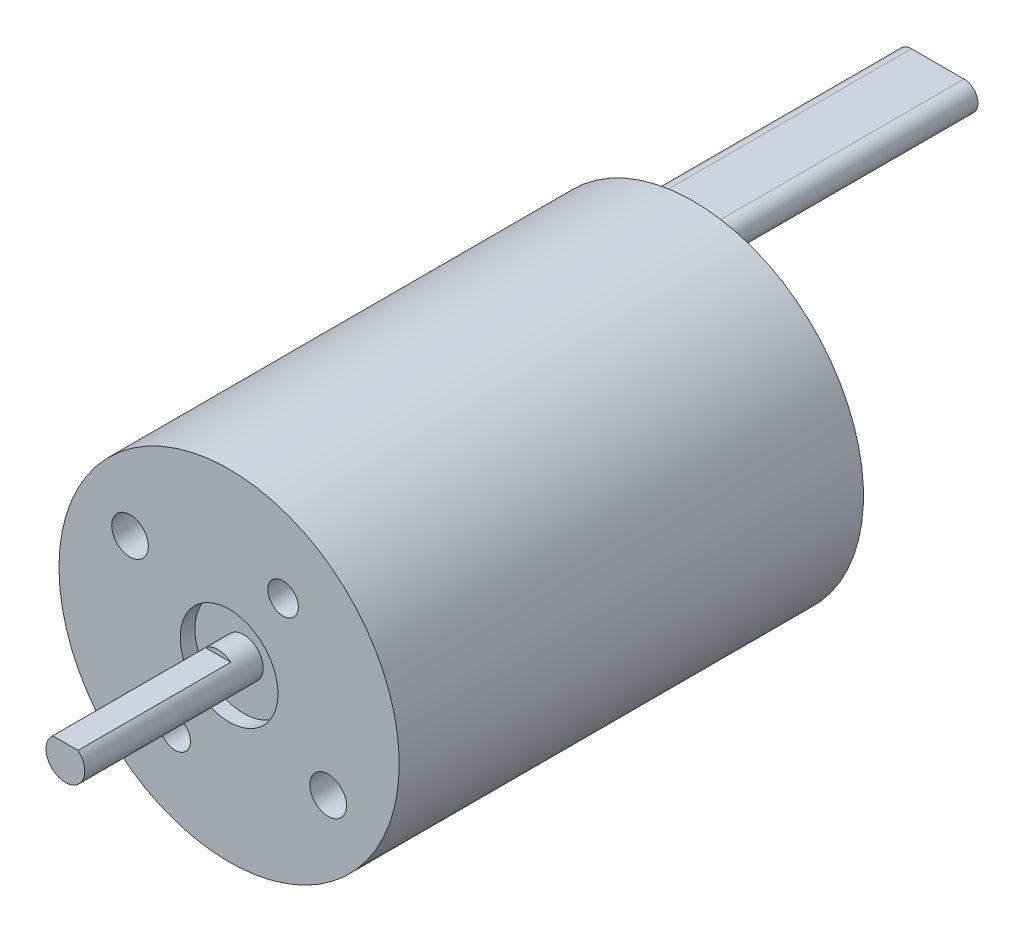
ISO-10303-21;
HEADER;
FILE_DESCRIPTION(('STEP AP214'),'2;1');
FILE_NAME('part.step','',(''),(''),'','','');
FILE_SCHEMA(('AUTOMOTIVE_DESIGN { 1 0 10303 214 1 1 1 1 }'));
ENDSEC;
DATA;
#1=APPLICATION_CONTEXT('core data for automotive mechanical design processes');
#2=APPLICATION_PROTOCOL_DEFINITION('international standard','automotive_design',2000,#1);
#3=PRODUCT_CONTEXT('',#1,'mechanical');
#4=PRODUCT('Part','Part','',(#3));
#5=PRODUCT_RELATED_PRODUCT_CATEGORY('part','',(#4));
#6=PRODUCT_DEFINITION_FORMATION('','',#4);
#7=PRODUCT_DEFINITION_CONTEXT('part definition',#1,'design');
#8=PRODUCT_DEFINITION('design','',#6,#7);
#9=PRODUCT_DEFINITION_SHAPE('','',#8);
#10=(LENGTH_UNIT() NAMED_UNIT(*) SI_UNIT(.MILLI.,.METRE.));
#11=(NAMED_UNIT(*) PLANE_ANGLE_UNIT() SI_UNIT($,.RADIAN.));
#12=(NAMED_UNIT(*) SI_UNIT($,.STERADIAN.) SOLID_ANGLE_UNIT());
#13=UNCERTAINTY_MEASURE_WITH_UNIT(LENGTH_MEASURE(1.E-05),#10,'distance_accuracy_value','');
#14=(GEOMETRIC_REPRESENTATION_CONTEXT(3) GLOBAL_UNCERTAINTY_ASSIGNED_CONTEXT((#13)) GLOBAL_UNIT_ASSIGNED_CONTEXT((#10,
#11,#12)) REPRESENTATION_CONTEXT('',''));
#15=CARTESIAN_POINT('',(0.,0.,0.));
#16=DIRECTION('',(0.,0.,1.));
#17=DIRECTION('',(1.,0.,0.));
#18=AXIS2_PLACEMENT_3D('',#15,#16,#17);
#19=CARTESIAN_POINT('',(-4.41582103560039,-6.96871757079802,-23.4));
#20=DIRECTION('',(0.,0.,1.));
#21=DIRECTION('',(1.,0.,0.));
#22=AXIS2_PLACEMENT_3D('',#19,#20,#21);
#23=PLANE('',#22);
#24=CARTESIAN_POINT('',(-4.41582103560039,-6.96871757079802,-23.4));
#25=DIRECTION('',(0.,0.,1.));
#26=DIRECTION('',(1.,0.,0.));
#27=AXIS2_PLACEMENT_3D('',#24,#25,#26);
#28=CIRCLE('',#27,1.25);
#29=CARTESIAN_POINT('',(-5.66582103560039,-6.96871757079802,-23.4));
#30=VERTEX_POINT('',#29);
#31=EDGE_CURVE('E270',#30,#30,#28,.T.);
#32=ORIENTED_EDGE('',*,*,#31,.T.);
#33=EDGE_LOOP('',(#32));
#34=FACE_BOUND('',#33,.T.);
#35=ADVANCED_FACE('F16',(#34),#23,.T.);
#36=CARTESIAN_POINT('',(8.10905317329227,-5.13840993233497,-23.4));
#37=DIRECTION('',(0.,0.,1.));
#38=DIRECTION('',(1.,0.,0.));
#39=AXIS2_PLACEMENT_3D('',#36,#37,#38);
#40=PLANE('',#39);
#41=CARTESIAN_POINT('',(8.10905317329227,-5.13840993233497,-23.4));
#42=DIRECTION('',(0.,0.,1.));
#43=DIRECTION('',(1.,0.,0.));
#44=AXIS2_PLACEMENT_3D('',#41,#42,#43);
#45=CIRCLE('',#44,1.5);
#46=CARTESIAN_POINT('',(6.60905317329227,-5.13840993233497,-23.4));
#47=VERTEX_POINT('',#46);
#48=EDGE_CURVE('E231',#47,#47,#45,.T.);
#49=ORIENTED_EDGE('',*,*,#48,.T.);
#50=EDGE_LOOP('',(#49));
#51=FACE_BOUND('',#50,.T.);
#52=ADVANCED_FACE('F469',(#51),#40,.T.);
#53=CARTESIAN_POINT('',(4.41582103560039,6.96871757079802,-23.4));
#54=DIRECTION('',(0.,0.,1.));
#55=DIRECTION('',(1.,0.,0.));
#56=AXIS2_PLACEMENT_3D('',#53,#54,#55);
#57=PLANE('',#56);
#58=CARTESIAN_POINT('',(4.41582103560039,6.96871757079802,-23.4));
#59=DIRECTION('',(0.,0.,1.));
#60=DIRECTION('',(1.,0.,0.));
#61=AXIS2_PLACEMENT_3D('',#58,#59,#60);
#62=CIRCLE('',#61,1.25);
#63=CARTESIAN_POINT('',(3.16582103560039,6.96871757079802,-23.4));
#64=VERTEX_POINT('',#63);
#65=EDGE_CURVE('E188',#64,#64,#62,.T.);
#66=ORIENTED_EDGE('',*,*,#65,.T.);
#67=EDGE_LOOP('',(#66));
#68=FACE_BOUND('',#67,.T.);
#69=ADVANCED_FACE('F464',(#68),#57,.T.);
#70=CARTESIAN_POINT('',(-8.10905317329226,5.13840993233497,-23.4));
#71=DIRECTION('',(0.,0.,1.));
#72=DIRECTION('',(1.,0.,0.));
#73=AXIS2_PLACEMENT_3D('',#70,#71,#72);
#74=PLANE('',#73);
#75=CARTESIAN_POINT('',(-8.10905317329226,5.13840993233497,-23.4));
#76=DIRECTION('',(0.,0.,1.));
#77=DIRECTION('',(1.,0.,0.));
#78=AXIS2_PLACEMENT_3D('',#75,#76,#77);
#79=CIRCLE('',#78,1.5);
#80=CARTESIAN_POINT('',(-9.60905317329226,5.13840993233497,-23.4));
#81=VERTEX_POINT('',#80);
#82=EDGE_CURVE('E164',#81,#81,#79,.T.);
#83=ORIENTED_EDGE('',*,*,#82,.T.);
#84=EDGE_LOOP('',(#83));
#85=FACE_BOUND('',#84,.T.);
#86=ADVANCED_FACE('F468',(#85),#74,.T.);
#87=CARTESIAN_POINT('',(2.15,12.5,-71.4));
#88=DIRECTION('',(0.,0.,-1.));
#89=DIRECTION('',(0.,-1.,0.));
#90=AXIS2_PLACEMENT_3D('',#87,#88,#89);
#91=PLANE('',#90);
#92=CARTESIAN_POINT('',(2.15,12.5,-71.4));
#93=DIRECTION('',(0.,0.,-1.));
#94=DIRECTION('',(-1.,0.,0.));
#95=AXIS2_PLACEMENT_3D('',#92,#93,#94);
#96=CIRCLE('',#95,1.15);
#97=CARTESIAN_POINT('',(2.15,13.65,-71.4));
#98=VERTEX_POINT('',#97);
#99=CARTESIAN_POINT('',(2.15,11.35,-71.4));
#100=VERTEX_POINT('',#99);
#101=EDGE_CURVE('E154',#98,#100,#96,.T.);
#102=ORIENTED_EDGE('',*,*,#101,.T.);
#103=DIRECTION('',(-1.,0.,0.));
#104=VECTOR('',#103,1.);
#105=CARTESIAN_POINT('',(2.15,11.35,-71.4));
#106=LINE('',#105,#104);
#107=CARTESIAN_POINT('',(-2.15,11.35,-71.4));
#108=VERTEX_POINT('',#107);
#109=EDGE_CURVE('E189',#100,#108,#106,.T.);
#110=ORIENTED_EDGE('',*,*,#109,.T.);
#111=CARTESIAN_POINT('',(-2.15,12.5,-71.4));
#112=DIRECTION('',(0.,0.,-1.));
#113=DIRECTION('',(-1.,0.,0.));
#114=AXIS2_PLACEMENT_3D('',#111,#112,#113);
#115=CIRCLE('',#114,1.15);
#116=CARTESIAN_POINT('',(-2.15,13.65,-71.4));
#117=VERTEX_POINT('',#116);
#118=EDGE_CURVE('E27',#108,#117,#115,.T.);
#119=ORIENTED_EDGE('',*,*,#118,.T.);
#120=DIRECTION('',(1.,0.,0.));
#121=VECTOR('',#120,1.);
#122=CARTESIAN_POINT('',(2.15,13.65,-71.4));
#123=LINE('',#122,#121);
#124=EDGE_CURVE('E11',#117,#98,#123,.T.);
#125=ORIENTED_EDGE('',*,*,#124,.T.);
#126=EDGE_LOOP('',(#102,#110,#119,#125));
#127=FACE_BOUND('',#126,.T.);
#128=ADVANCED_FACE('F306',(#127),#91,.T.);
#129=CARTESIAN_POINT('',(2.15,13.65,-71.4));
#130=DIRECTION('',(0.,-1.,0.));
#131=DIRECTION('',(0.,0.,-1.));
#132=AXIS2_PLACEMENT_3D('',#129,#130,#131);
#133=PLANE('',#132);
#134=DIRECTION('',(1.,0.,0.));
#135=VECTOR('',#134,1.);
#136=CARTESIAN_POINT('',(2.15,13.65,-51.4));
#137=LINE('',#136,#135);
#138=CARTESIAN_POINT('',(-2.15,13.65,-51.4));
#139=VERTEX_POINT('',#138);
#140=CARTESIAN_POINT('',(2.15,13.65,-51.4));
#141=VERTEX_POINT('',#140);
#142=EDGE_CURVE('E170',#139,#141,#137,.T.);
#143=ORIENTED_EDGE('',*,*,#142,.T.);
#144=DIRECTION('',(0.,0.,1.));
#145=VECTOR('',#144,1.);
#146=CARTESIAN_POINT('',(2.15,13.65,-71.4));
#147=LINE('',#146,#145);
#148=EDGE_CURVE('E162',#98,#141,#147,.T.);
#149=ORIENTED_EDGE('',*,*,#148,.F.);
#150=ORIENTED_EDGE('',*,*,#124,.F.);
#151=DIRECTION('',(0.,0.,1.));
#152=VECTOR('',#151,1.);
#153=CARTESIAN_POINT('',(-2.15,13.65,-71.4));
#154=LINE('',#153,#152);
#155=EDGE_CURVE('E193',#117,#139,#154,.T.);
#156=ORIENTED_EDGE('',*,*,#155,.T.);
#157=EDGE_LOOP('',(#143,#149,#150,#156));
#158=FACE_BOUND('',#157,.T.);
#159=ADVANCED_FACE('F308',(#158),#133,.F.);
#160=CARTESIAN_POINT('',(-2.15,12.5,-71.4));
#161=DIRECTION('',(0.,0.,1.));
#162=DIRECTION('',(-1.,0.,0.));
#163=AXIS2_PLACEMENT_3D('',#160,#161,#162);
#164=CYLINDRICAL_SURFACE('',#163,1.15);
#165=CARTESIAN_POINT('',(-2.15,12.5,-51.4));
#166=DIRECTION('',(0.,0.,-1.));
#167=DIRECTION('',(-1.,0.,0.));
#168=AXIS2_PLACEMENT_3D('',#165,#166,#167);
#169=CIRCLE('',#168,1.15);
#170=CARTESIAN_POINT('',(-2.15,11.35,-51.4));
#171=VERTEX_POINT('',#170);
#172=EDGE_CURVE('E168',#171,#139,#169,.T.);
#173=ORIENTED_EDGE('',*,*,#172,.T.);
#174=ORIENTED_EDGE('',*,*,#155,.F.);
#175=ORIENTED_EDGE('',*,*,#118,.F.);
#176=DIRECTION('',(0.,0.,1.));
#177=VECTOR('',#176,1.);
#178=CARTESIAN_POINT('',(-2.15,11.35,-71.4));
#179=LINE('',#178,#177);
#180=EDGE_CURVE('E194',#108,#171,#179,.T.);
#181=ORIENTED_EDGE('',*,*,#180,.T.);
#182=EDGE_LOOP('',(#173,#174,#175,#181));
#183=FACE_BOUND('',#182,.T.);
#184=ADVANCED_FACE('F310',(#183),#164,.T.);
#185=CARTESIAN_POINT('',(2.15,11.35,-71.4));
#186=DIRECTION('',(0.,1.,0.));
#187=DIRECTION('',(1.,0.,0.));
#188=AXIS2_PLACEMENT_3D('',#185,#186,#187);
#189=PLANE('',#188);
#190=DIRECTION('',(-1.,0.,0.));
#191=VECTOR('',#190,1.);
#192=CARTESIAN_POINT('',(2.15,11.35,-51.4));
#193=LINE('',#192,#191);
#194=CARTESIAN_POINT('',(2.15,11.35,-51.4));
#195=VERTEX_POINT('',#194);
#196=EDGE_CURVE('E219',#195,#171,#193,.T.);
#197=ORIENTED_EDGE('',*,*,#196,.T.);
#198=ORIENTED_EDGE('',*,*,#180,.F.);
#199=ORIENTED_EDGE('',*,*,#109,.F.);
#200=DIRECTION('',(0.,0.,1.));
#201=VECTOR('',#200,1.);
#202=CARTESIAN_POINT('',(2.15,11.35,-71.4));
#203=LINE('',#202,#201);
#204=EDGE_CURVE('E180',#100,#195,#203,.T.);
#205=ORIENTED_EDGE('',*,*,#204,.T.);
#206=EDGE_LOOP('',(#197,#198,#199,#205));
#207=FACE_BOUND('',#206,.T.);
#208=ADVANCED_FACE('F304',(#207),#189,.F.);
#209=CARTESIAN_POINT('',(0.,0.,-12.5));
#210=DIRECTION('',(0.,0.,-1.));
#211=DIRECTION('',(0.,-1.,0.));
#212=AXIS2_PLACEMENT_3D('',#209,#210,#211);
#213=PLANE('',#212);
#214=CARTESIAN_POINT('',(0.,0.,-12.5));
#215=DIRECTION('',(0.,0.,1.));
#216=DIRECTION('',(-1.,0.,0.));
#217=AXIS2_PLACEMENT_3D('',#214,#215,#216);
#218=CIRCLE('',#217,1.5875);
#219=CARTESIAN_POINT('',(1.03641208020748,1.2025,-12.5));
#220=VERTEX_POINT('',#219);
#221=CARTESIAN_POINT('',(-1.03641208020748,1.2025,-12.5));
#222=VERTEX_POINT('',#221);
#223=EDGE_CURVE('E252',#220,#222,#218,.T.);
#224=ORIENTED_EDGE('',*,*,#223,.T.);
#225=DIRECTION('',(1.,0.,0.));
#226=VECTOR('',#225,1.);
#227=CARTESIAN_POINT('',(-1.03641208020748,1.2025,-12.5));
#228=LINE('',#227,#226);
#229=EDGE_CURVE('E218',#222,#220,#228,.T.);
#230=ORIENTED_EDGE('',*,*,#229,.T.);
#231=EDGE_LOOP('',(#224,#230));
#232=FACE_BOUND('',#231,.T.);
#233=ADVANCED_FACE('F512',(#232),#213,.F.);
#234=CARTESIAN_POINT('',(-1.03641208020748,1.2025,-12.5));
#235=DIRECTION('',(0.,-1.,0.));
#236=DIRECTION('',(0.,0.,-1.));
#237=AXIS2_PLACEMENT_3D('',#234,#235,#236);
#238=PLANE('',#237);
#239=DIRECTION('',(1.,0.,0.));
#240=VECTOR('',#239,1.);
#241=CARTESIAN_POINT('',(-1.03641208020748,1.2025,0.));
#242=LINE('',#241,#240);
#243=CARTESIAN_POINT('',(-1.03641208020748,1.2025,0.));
#244=VERTEX_POINT('',#243);
#245=CARTESIAN_POINT('',(1.03641208020748,1.2025,0.));
#246=VERTEX_POINT('',#245);
#247=EDGE_CURVE('E215',#244,#246,#242,.T.);
#248=ORIENTED_EDGE('',*,*,#247,.T.);
#249=DIRECTION('',(0.,0.,1.));
#250=VECTOR('',#249,1.);
#251=CARTESIAN_POINT('',(1.03641208020748,1.2025,-12.5));
#252=LINE('',#251,#250);
#253=EDGE_CURVE('E247',#220,#246,#252,.T.);
#254=ORIENTED_EDGE('',*,*,#253,.F.);
#255=ORIENTED_EDGE('',*,*,#229,.F.);
#256=DIRECTION('',(0.,0.,1.));
#257=VECTOR('',#256,1.);
#258=CARTESIAN_POINT('',(-1.03641208020748,1.2025,-12.5));
#259=LINE('',#258,#257);
#260=EDGE_CURVE('E243',#222,#244,#259,.T.);
#261=ORIENTED_EDGE('',*,*,#260,.T.);
#262=EDGE_LOOP('',(#248,#254,#255,#261));
#263=FACE_BOUND('',#262,.T.);
#264=ADVANCED_FACE('F507',(#263),#238,.F.);
#265=CARTESIAN_POINT('',(0.,0.,0.));
#266=DIRECTION('',(0.,0.,-1.));
#267=DIRECTION('',(0.,-1.,0.));
#268=AXIS2_PLACEMENT_3D('',#265,#266,#267);
#269=PLANE('',#268);
#270=CARTESIAN_POINT('',(0.,0.,0.));
#271=DIRECTION('',(0.,0.,1.));
#272=DIRECTION('',(1.,0.,0.));
#273=AXIS2_PLACEMENT_3D('',#270,#271,#272);
#274=CIRCLE('',#273,1.5875);
#275=CARTESIAN_POINT('',(-1.5875,0.,0.));
#276=VERTEX_POINT('',#275);
#277=EDGE_CURVE('E184',#244,#276,#274,.T.);
#278=ORIENTED_EDGE('',*,*,#277,.T.);
#279=CARTESIAN_POINT('',(0.,0.,0.));
#280=DIRECTION('',(0.,0.,1.));
#281=DIRECTION('',(1.,0.,0.));
#282=AXIS2_PLACEMENT_3D('',#279,#280,#281);
#283=CIRCLE('',#282,1.5875);
#284=EDGE_CURVE('E251',#276,#246,#283,.T.);
#285=ORIENTED_EDGE('',*,*,#284,.T.);
#286=ORIENTED_EDGE('',*,*,#247,.F.);
#287=EDGE_LOOP('',(#278,#285,#286));
#288=FACE_BOUND('',#287,.T.);
#289=ADVANCED_FACE('F511',(#288),#269,.F.);
#290=CARTESIAN_POINT('',(0.,0.,-14.6));
#291=DIRECTION('',(0.,0.,1.));
#292=DIRECTION('',(1.,0.,0.));
#293=AXIS2_PLACEMENT_3D('',#290,#291,#292);
#294=PLANE('',#293);
#295=CARTESIAN_POINT('',(0.,0.,-14.6));
#296=DIRECTION('',(0.,0.,1.));
#297=DIRECTION('',(1.,0.,0.));
#298=AXIS2_PLACEMENT_3D('',#295,#296,#297);
#299=CIRCLE('',#298,1.5875);
#300=CARTESIAN_POINT('',(-1.5875,0.,-14.6));
#301=VERTEX_POINT('',#300);
#302=EDGE_CURVE('E179',#301,#301,#299,.T.);
#303=ORIENTED_EDGE('',*,*,#302,.F.);
#304=EDGE_LOOP('',(#303));
#305=FACE_BOUND('',#304,.T.);
#306=CARTESIAN_POINT('',(0.,0.,-14.6));
#307=DIRECTION('',(0.,0.,1.));
#308=DIRECTION('',(1.,0.,0.));
#309=AXIS2_PLACEMENT_3D('',#306,#307,#308);
#310=CIRCLE('',#309,4.);
#311=CARTESIAN_POINT('',(-4.,0.,-14.6));
#312=VERTEX_POINT('',#311);
#313=EDGE_CURVE('E174',#312,#312,#310,.T.);
#314=ORIENTED_EDGE('',*,*,#313,.T.);
#315=EDGE_LOOP('',(#314));
#316=FACE_BOUND('',#315,.T.);
#317=ADVANCED_FACE('F523',(#305,#316),#294,.T.);
#318=CARTESIAN_POINT('',(0.,4.,-49.5));
#319=DIRECTION('',(0.,0.,1.));
#320=DIRECTION('',(1.,0.,0.));
#321=AXIS2_PLACEMENT_3D('',#318,#319,#320);
#322=PLANE('',#321);
#323=CARTESIAN_POINT('',(0.,0.,-49.5));
#324=DIRECTION('',(0.,0.,1.));
#325=DIRECTION('',(1.,0.,0.));
#326=AXIS2_PLACEMENT_3D('',#323,#324,#325);
#327=CIRCLE('',#326,4.);
#328=CARTESIAN_POINT('',(-4.,0.,-49.5));
#329=VERTEX_POINT('',#328);
#330=EDGE_CURVE('E204',#329,#329,#327,.T.);
#331=ORIENTED_EDGE('',*,*,#330,.F.);
#332=EDGE_LOOP('',(#331));
#333=FACE_BOUND('',#332,.T.);
#334=ADVANCED_FACE('F518',(#333),#322,.F.);
#335=CARTESIAN_POINT('',(0.,1.5875,-13.4));
#336=DIRECTION('',(0.,0.,-1.));
#337=DIRECTION('',(0.,-1.,0.));
#338=AXIS2_PLACEMENT_3D('',#335,#336,#337);
#339=PLANE('',#338);
#340=CARTESIAN_POINT('',(0.,0.,-13.4));
#341=DIRECTION('',(0.,0.,1.));
#342=DIRECTION('',(1.,0.,0.));
#343=AXIS2_PLACEMENT_3D('',#340,#341,#342);
#344=CIRCLE('',#343,4.);
#345=CARTESIAN_POINT('',(-4.,0.,-13.4));
#346=VERTEX_POINT('',#345);
#347=EDGE_CURVE('E198',#346,#346,#344,.T.);
#348=ORIENTED_EDGE('',*,*,#347,.F.);
#349=EDGE_LOOP('',(#348));
#350=FACE_BOUND('',#349,.T.);
#351=CARTESIAN_POINT('',(-8.10905317329226,5.13840993233497,-13.4));
#352=DIRECTION('',(0.,0.,1.));
#353=DIRECTION('',(1.,0.,0.));
#354=AXIS2_PLACEMENT_3D('',#351,#352,#353);
#355=CIRCLE('',#354,1.5);
#356=CARTESIAN_POINT('',(-9.60905317329226,5.13840993233497,-13.4));
#357=VERTEX_POINT('',#356);
#358=EDGE_CURVE('E147',#357,#357,#355,.T.);
#359=ORIENTED_EDGE('',*,*,#358,.F.);
#360=EDGE_LOOP('',(#359));
#361=FACE_BOUND('',#360,.T.);
#362=CARTESIAN_POINT('',(4.41582103560039,6.96871757079802,-13.4));
#363=DIRECTION('',(0.,0.,1.));
#364=DIRECTION('',(1.,0.,0.));
#365=AXIS2_PLACEMENT_3D('',#362,#363,#364);
#366=CIRCLE('',#365,1.25);
#367=CARTESIAN_POINT('',(3.16582103560039,6.96871757079802,-13.4));
#368=VERTEX_POINT('',#367);
#369=EDGE_CURVE('E187',#368,#368,#366,.T.);
#370=ORIENTED_EDGE('',*,*,#369,.F.);
#371=EDGE_LOOP('',(#370));
#372=FACE_BOUND('',#371,.T.);
#373=CARTESIAN_POINT('',(8.10905317329227,-5.13840993233497,-13.4));
#374=DIRECTION('',(0.,0.,1.));
#375=DIRECTION('',(1.,0.,0.));
#376=AXIS2_PLACEMENT_3D('',#373,#374,#375);
#377=CIRCLE('',#376,1.5);
#378=CARTESIAN_POINT('',(6.60905317329227,-5.13840993233497,-13.4));
#379=VERTEX_POINT('',#378);
#380=EDGE_CURVE('E109',#379,#379,#377,.T.);
#381=ORIENTED_EDGE('',*,*,#380,.F.);
#382=EDGE_LOOP('',(#381));
#383=FACE_BOUND('',#382,.T.);
#384=CARTESIAN_POINT('',(-4.41582103560039,-6.96871757079802,-13.4));
#385=DIRECTION('',(0.,0.,1.));
#386=DIRECTION('',(1.,0.,0.));
#387=AXIS2_PLACEMENT_3D('',#384,#385,#386);
#388=CIRCLE('',#387,1.25);
#389=CARTESIAN_POINT('',(-5.66582103560039,-6.96871757079802,-13.4));
#390=VERTEX_POINT('',#389);
#391=EDGE_CURVE('E232',#390,#390,#388,.T.);
#392=ORIENTED_EDGE('',*,*,#391,.F.);
#393=EDGE_LOOP('',(#392));
#394=FACE_BOUND('',#393,.T.);
#395=CARTESIAN_POINT('',(0.,0.,-13.4));
#396=DIRECTION('',(0.,0.,1.));
#397=DIRECTION('',(1.,0.,0.));
#398=AXIS2_PLACEMENT_3D('',#395,#396,#397);
#399=CIRCLE('',#398,13.925);
#400=CARTESIAN_POINT('',(-13.925,0.,-13.4));
#401=VERTEX_POINT('',#400);
#402=EDGE_CURVE('E207',#401,#401,#399,.T.);
#403=ORIENTED_EDGE('',*,*,#402,.T.);
#404=EDGE_LOOP('',(#403));
#405=FACE_BOUND('',#404,.T.);
#406=ADVANCED_FACE('F522',(#350,#361,#372,#383,#394,#405),#339,.F.);
#407=CARTESIAN_POINT('',(0.,13.925,-51.4));
#408=DIRECTION('',(0.,0.,1.));
#409=DIRECTION('',(1.,0.,0.));
#410=AXIS2_PLACEMENT_3D('',#407,#408,#409);
#411=PLANE('',#410);
#412=CARTESIAN_POINT('',(0.,0.,-51.4));
#413=DIRECTION('',(0.,0.,1.));
#414=DIRECTION('',(1.,0.,0.));
#415=AXIS2_PLACEMENT_3D('',#412,#413,#414);
#416=CIRCLE('',#415,4.);
#417=CARTESIAN_POINT('',(-4.,0.,-51.4));
#418=VERTEX_POINT('',#417);
#419=EDGE_CURVE('E201',#418,#418,#416,.T.);
#420=ORIENTED_EDGE('',*,*,#419,.T.);
#421=EDGE_LOOP('',(#420));
#422=FACE_BOUND('',#421,.T.);
#423=CARTESIAN_POINT('',(2.15,12.5,-51.4));
#424=DIRECTION('',(0.,0.,-1.));
#425=DIRECTION('',(-1.,0.,0.));
#426=AXIS2_PLACEMENT_3D('',#423,#424,#425);
#427=CIRCLE('',#426,1.15);
#428=EDGE_CURVE('E20',#141,#195,#427,.T.);
#429=ORIENTED_EDGE('',*,*,#428,.F.);
#430=ORIENTED_EDGE('',*,*,#142,.F.);
#431=ORIENTED_EDGE('',*,*,#172,.F.);
#432=ORIENTED_EDGE('',*,*,#196,.F.);
#433=EDGE_LOOP('',(#429,#430,#431,#432));
#434=FACE_BOUND('',#433,.T.);
#435=CARTESIAN_POINT('',(0.,0.,-51.4));
#436=DIRECTION('',(0.,0.,1.));
#437=DIRECTION('',(1.,0.,0.));
#438=AXIS2_PLACEMENT_3D('',#435,#436,#437);
#439=CIRCLE('',#438,13.925);
#440=CARTESIAN_POINT('',(-13.925,0.,-51.4));
#441=VERTEX_POINT('',#440);
#442=EDGE_CURVE('E173',#441,#441,#439,.T.);
#443=ORIENTED_EDGE('',*,*,#442,.F.);
#444=EDGE_LOOP('',(#443));
#445=FACE_BOUND('',#444,.T.);
#446=ADVANCED_FACE('F298',(#422,#434,#445),#411,.F.);
#447=CARTESIAN_POINT('',(0.,0.,0.));
#448=DIRECTION('',(0.,0.,1.));
#449=DIRECTION('',(1.,0.,0.));
#450=AXIS2_PLACEMENT_3D('',#447,#448,#449);
#451=CYLINDRICAL_SURFACE('',#450,13.925);
#452=ORIENTED_EDGE('',*,*,#402,.F.);
#453=DIRECTION('',(0.,0.,-1.));
#454=VECTOR('',#453,1.);
#455=CARTESIAN_POINT('',(-13.925,0.,0.));
#456=LINE('',#455,#454);
#457=EDGE_CURVE('E228',#401,#441,#456,.T.);
#458=ORIENTED_EDGE('',*,*,#457,.T.);
#459=ORIENTED_EDGE('',*,*,#442,.T.);
#460=ORIENTED_EDGE('',*,*,#457,.F.);
#461=EDGE_LOOP('',(#452,#458,#459,#460));
#462=FACE_BOUND('',#461,.T.);
#463=ADVANCED_FACE('F434',(#462),#451,.T.);
#464=CARTESIAN_POINT('',(0.,0.,0.));
#465=DIRECTION('',(0.,0.,1.));
#466=DIRECTION('',(1.,0.,0.));
#467=AXIS2_PLACEMENT_3D('',#464,#465,#466);
#468=CYLINDRICAL_SURFACE('',#467,4.);
#469=ORIENTED_EDGE('',*,*,#419,.F.);
#470=DIRECTION('',(0.,0.,1.));
#471=VECTOR('',#470,1.);
#472=CARTESIAN_POINT('',(-4.,0.,0.));
#473=LINE('',#472,#471);
#474=EDGE_CURVE('E208',#418,#329,#473,.T.);
#475=ORIENTED_EDGE('',*,*,#474,.T.);
#476=ORIENTED_EDGE('',*,*,#330,.T.);
#477=ORIENTED_EDGE('',*,*,#474,.F.);
#478=EDGE_LOOP('',(#469,#475,#476,#477));
#479=FACE_BOUND('',#478,.T.);
#480=ADVANCED_FACE('F429',(#479),#468,.F.);
#481=CARTESIAN_POINT('',(0.,0.,-14.6));
#482=DIRECTION('',(0.,0.,1.));
#483=DIRECTION('',(1.,0.,0.));
#484=AXIS2_PLACEMENT_3D('',#481,#482,#483);
#485=CYLINDRICAL_SURFACE('',#484,4.);
#486=ORIENTED_EDGE('',*,*,#313,.F.);
#487=DIRECTION('',(0.,0.,1.));
#488=VECTOR('',#487,1.);
#489=CARTESIAN_POINT('',(-4.,0.,-14.6));
#490=LINE('',#489,#488);
#491=EDGE_CURVE('E178',#312,#346,#490,.T.);
#492=ORIENTED_EDGE('',*,*,#491,.T.);
#493=ORIENTED_EDGE('',*,*,#347,.T.);
#494=ORIENTED_EDGE('',*,*,#491,.F.);
#495=EDGE_LOOP('',(#486,#492,#493,#494));
#496=FACE_BOUND('',#495,.T.);
#497=ADVANCED_FACE('F433',(#496),#485,.F.);
#498=CARTESIAN_POINT('',(0.,0.,0.));
#499=DIRECTION('',(0.,0.,1.));
#500=DIRECTION('',(1.,0.,0.));
#501=AXIS2_PLACEMENT_3D('',#498,#499,#500);
#502=CYLINDRICAL_SURFACE('',#501,1.5875);
#503=ORIENTED_EDGE('',*,*,#277,.F.);
#504=ORIENTED_EDGE('',*,*,#260,.F.);
#505=ORIENTED_EDGE('',*,*,#223,.F.);
#506=ORIENTED_EDGE('',*,*,#253,.T.);
#507=ORIENTED_EDGE('',*,*,#284,.F.);
#508=DIRECTION('',(0.,0.,-1.));
#509=VECTOR('',#508,1.);
#510=CARTESIAN_POINT('',(-1.5875,0.,0.));
#511=LINE('',#510,#509);
#512=EDGE_CURVE('E211',#276,#301,#511,.T.);
#513=ORIENTED_EDGE('',*,*,#512,.T.);
#514=ORIENTED_EDGE('',*,*,#302,.T.);
#515=ORIENTED_EDGE('',*,*,#512,.F.);
#516=EDGE_LOOP('',(#503,#504,#505,#506,#507,#513,#514,#515));
#517=FACE_BOUND('',#516,.T.);
#518=ADVANCED_FACE('F425',(#517),#502,.T.);
#519=CARTESIAN_POINT('',(2.15,12.5,-71.4));
#520=DIRECTION('',(0.,0.,1.));
#521=DIRECTION('',(1.,0.,0.));
#522=AXIS2_PLACEMENT_3D('',#519,#520,#521);
#523=CYLINDRICAL_SURFACE('',#522,1.15);
#524=ORIENTED_EDGE('',*,*,#101,.F.);
#525=ORIENTED_EDGE('',*,*,#148,.T.);
#526=ORIENTED_EDGE('',*,*,#428,.T.);
#527=ORIENTED_EDGE('',*,*,#204,.F.);
#528=EDGE_LOOP('',(#524,#525,#526,#527));
#529=FACE_BOUND('',#528,.T.);
#530=ADVANCED_FACE('F18',(#529),#523,.T.);
#531=CARTESIAN_POINT('',(-8.10905317329226,5.13840993233497,-23.4));
#532=DIRECTION('',(0.,0.,1.));
#533=DIRECTION('',(1.,0.,0.));
#534=AXIS2_PLACEMENT_3D('',#531,#532,#533);
#535=CYLINDRICAL_SURFACE('',#534,1.5);
#536=ORIENTED_EDGE('',*,*,#82,.F.);
#537=DIRECTION('',(0.,0.,1.));
#538=VECTOR('',#537,1.);
#539=CARTESIAN_POINT('',(-9.60905317329226,5.13840993233497,-23.4));
#540=LINE('',#539,#538);
#541=EDGE_CURVE('E150',#81,#357,#540,.T.);
#542=ORIENTED_EDGE('',*,*,#541,.T.);
#543=ORIENTED_EDGE('',*,*,#358,.T.);
#544=ORIENTED_EDGE('',*,*,#541,.F.);
#545=EDGE_LOOP('',(#536,#542,#543,#544));
#546=FACE_BOUND('',#545,.T.);
#547=ADVANCED_FACE('F149',(#546),#535,.F.);
#548=CARTESIAN_POINT('',(4.41582103560039,6.96871757079802,-23.4));
#549=DIRECTION('',(0.,0.,1.));
#550=DIRECTION('',(1.,0.,0.));
#551=AXIS2_PLACEMENT_3D('',#548,#549,#550);
#552=CYLINDRICAL_SURFACE('',#551,1.25);
#553=ORIENTED_EDGE('',*,*,#65,.F.);
#554=DIRECTION('',(0.,0.,1.));
#555=VECTOR('',#554,1.);
#556=CARTESIAN_POINT('',(3.16582103560039,6.96871757079802,-23.4));
#557=LINE('',#556,#555);
#558=EDGE_CURVE('E120',#64,#368,#557,.T.);
#559=ORIENTED_EDGE('',*,*,#558,.T.);
#560=ORIENTED_EDGE('',*,*,#369,.T.);
#561=ORIENTED_EDGE('',*,*,#558,.F.);
#562=EDGE_LOOP('',(#553,#559,#560,#561));
#563=FACE_BOUND('',#562,.T.);
#564=ADVANCED_FACE('F439',(#563),#552,.F.);
#565=CARTESIAN_POINT('',(8.10905317329227,-5.13840993233497,-23.4));
#566=DIRECTION('',(0.,0.,1.));
#567=DIRECTION('',(1.,0.,0.));
#568=AXIS2_PLACEMENT_3D('',#565,#566,#567);
#569=CYLINDRICAL_SURFACE('',#568,1.5);
#570=ORIENTED_EDGE('',*,*,#48,.F.);
#571=DIRECTION('',(0.,0.,1.));
#572=VECTOR('',#571,1.);
#573=CARTESIAN_POINT('',(6.60905317329227,-5.13840993233497,-23.4));
#574=LINE('',#573,#572);
#575=EDGE_CURVE('E197',#47,#379,#574,.T.);
#576=ORIENTED_EDGE('',*,*,#575,.T.);
#577=ORIENTED_EDGE('',*,*,#380,.T.);
#578=ORIENTED_EDGE('',*,*,#575,.F.);
#579=EDGE_LOOP('',(#570,#576,#577,#578));
#580=FACE_BOUND('',#579,.T.);
#581=ADVANCED_FACE('F443',(#580),#569,.F.);
#582=CARTESIAN_POINT('',(-4.41582103560039,-6.96871757079802,-23.4));
#583=DIRECTION('',(0.,0.,1.));
#584=DIRECTION('',(1.,0.,0.));
#585=AXIS2_PLACEMENT_3D('',#582,#583,#584);
#586=CYLINDRICAL_SURFACE('',#585,1.25);
#587=ORIENTED_EDGE('',*,*,#31,.F.);
#588=DIRECTION('',(0.,0.,1.));
#589=VECTOR('',#588,1.);
#590=CARTESIAN_POINT('',(-5.66582103560039,-6.96871757079802,-23.4));
#591=LINE('',#590,#589);
#592=EDGE_CURVE('E235',#30,#390,#591,.T.);
#593=ORIENTED_EDGE('',*,*,#592,.T.);
#594=ORIENTED_EDGE('',*,*,#391,.T.);
#595=ORIENTED_EDGE('',*,*,#592,.F.);
#596=EDGE_LOOP('',(#587,#593,#594,#595));
#597=FACE_BOUND('',#596,.T.);
#598=ADVANCED_FACE('F455',(#597),#586,.F.);
#599=CLOSED_SHELL('',(#35,#52,#69,#86,#128,#159,#184,#208,#233,#264,#289,#317,#334,#406,#446,
#463,#480,#497,#518,#530,#547,#564,#581,#598));
#600=MANIFOLD_SOLID_BREP('B1',#599);
#601=ADVANCED_BREP_SHAPE_REPRESENTATION('',(#18,#600),#14);
#602=SHAPE_DEFINITION_REPRESENTATION(#9,#601);
ENDSEC;
END-ISO-10303-21;
